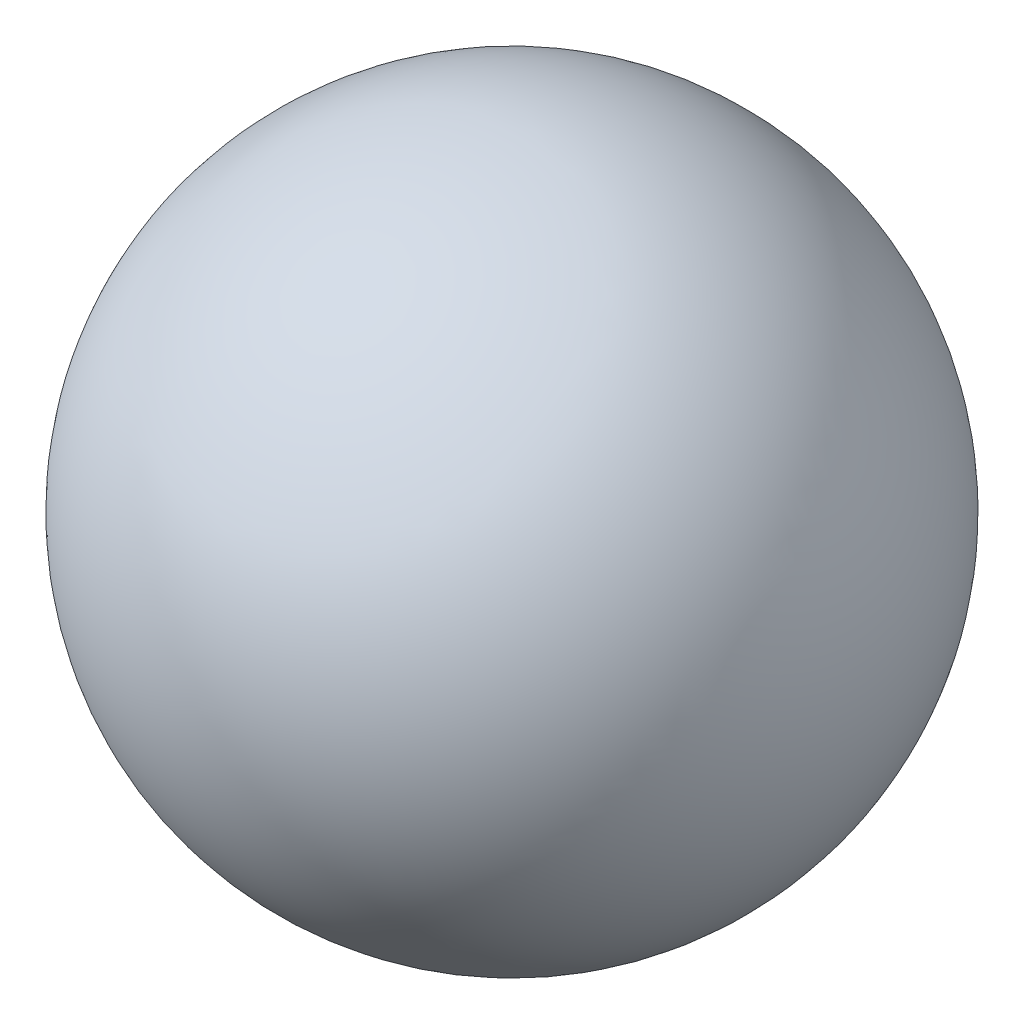
ISO-10303-21;
HEADER;
FILE_DESCRIPTION(('STEP AP214'),'2;1');
FILE_NAME('part.step','',(''),(''),'','','');
FILE_SCHEMA(('AUTOMOTIVE_DESIGN { 1 0 10303 214 1 1 1 1 }'));
ENDSEC;
DATA;
#1=APPLICATION_CONTEXT('core data for automotive mechanical design processes');
#2=APPLICATION_PROTOCOL_DEFINITION('international standard','automotive_design',2000,#1);
#3=PRODUCT_CONTEXT('',#1,'mechanical');
#4=PRODUCT('Part','Part','',(#3));
#5=PRODUCT_RELATED_PRODUCT_CATEGORY('part','',(#4));
#6=PRODUCT_DEFINITION_FORMATION('','',#4);
#7=PRODUCT_DEFINITION_CONTEXT('part definition',#1,'design');
#8=PRODUCT_DEFINITION('design','',#6,#7);
#9=PRODUCT_DEFINITION_SHAPE('','',#8);
#10=(LENGTH_UNIT() NAMED_UNIT(*) SI_UNIT(.MILLI.,.METRE.));
#11=(NAMED_UNIT(*) PLANE_ANGLE_UNIT() SI_UNIT($,.RADIAN.));
#12=(NAMED_UNIT(*) SI_UNIT($,.STERADIAN.) SOLID_ANGLE_UNIT());
#13=UNCERTAINTY_MEASURE_WITH_UNIT(LENGTH_MEASURE(1.E-05),#10,'distance_accuracy_value','');
#14=(GEOMETRIC_REPRESENTATION_CONTEXT(3) GLOBAL_UNCERTAINTY_ASSIGNED_CONTEXT((#13)) GLOBAL_UNIT_ASSIGNED_CONTEXT((#10,
#11,#12)) REPRESENTATION_CONTEXT('',''));
#15=CARTESIAN_POINT('',(0.,0.,0.));
#16=DIRECTION('',(0.,0.,1.));
#17=DIRECTION('',(1.,0.,0.));
#18=AXIS2_PLACEMENT_3D('',#15,#16,#17);
#19=CARTESIAN_POINT('',(0.,0.,0.));
#20=DIRECTION('',(-1.,0.,0.));
#21=DIRECTION('',(0.,1.,0.));
#22=AXIS2_PLACEMENT_3D('',#19,#20,#21);
#23=SPHERICAL_SURFACE('',#22,88.9);
#24=CARTESIAN_POINT('',(-88.9,0.,0.));
#25=VERTEX_POINT('',#24);
#26=VERTEX_LOOP('',#25);
#27=FACE_BOUND('',#26,.T.);
#28=ADVANCED_FACE('F33',(#27),#23,.T.);
#29=CLOSED_SHELL('',(#28));
#30=MANIFOLD_SOLID_BREP('B2',#29);
#31=ADVANCED_BREP_SHAPE_REPRESENTATION('',(#18,#30),#14);
#32=SHAPE_DEFINITION_REPRESENTATION(#9,#31);
ENDSEC;
END-ISO-10303-21;
